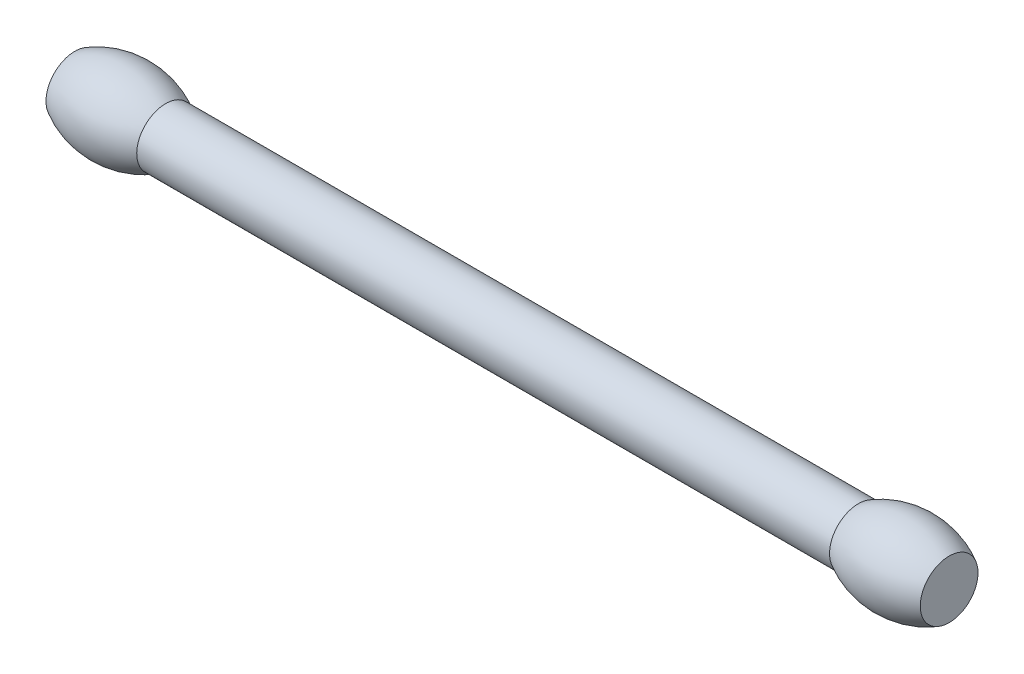
ISO-10303-21;
HEADER;
FILE_DESCRIPTION(('STEP AP214'),'2;1');
FILE_NAME('part.step','',(''),(''),'','','');
FILE_SCHEMA(('AUTOMOTIVE_DESIGN { 1 0 10303 214 1 1 1 1 }'));
ENDSEC;
DATA;
#1=APPLICATION_CONTEXT('core data for automotive mechanical design processes');
#2=APPLICATION_PROTOCOL_DEFINITION('international standard','automotive_design',2000,#1);
#3=PRODUCT_CONTEXT('',#1,'mechanical');
#4=PRODUCT('Part','Part','',(#3));
#5=PRODUCT_RELATED_PRODUCT_CATEGORY('part','',(#4));
#6=PRODUCT_DEFINITION_FORMATION('','',#4);
#7=PRODUCT_DEFINITION_CONTEXT('part definition',#1,'design');
#8=PRODUCT_DEFINITION('design','',#6,#7);
#9=PRODUCT_DEFINITION_SHAPE('','',#8);
#10=(LENGTH_UNIT() NAMED_UNIT(*) SI_UNIT(.MILLI.,.METRE.));
#11=(NAMED_UNIT(*) PLANE_ANGLE_UNIT() SI_UNIT($,.RADIAN.));
#12=(NAMED_UNIT(*) SI_UNIT($,.STERADIAN.) SOLID_ANGLE_UNIT());
#13=UNCERTAINTY_MEASURE_WITH_UNIT(LENGTH_MEASURE(1.E-05),#10,'distance_accuracy_value','');
#14=(GEOMETRIC_REPRESENTATION_CONTEXT(3) GLOBAL_UNCERTAINTY_ASSIGNED_CONTEXT((#13)) GLOBAL_UNIT_ASSIGNED_CONTEXT((#10,
#11,#12)) REPRESENTATION_CONTEXT('',''));
#15=CARTESIAN_POINT('',(0.,0.,0.));
#16=DIRECTION('',(0.,0.,1.));
#17=DIRECTION('',(1.,0.,0.));
#18=AXIS2_PLACEMENT_3D('',#15,#16,#17);
#19=CARTESIAN_POINT('',(54.2925,0.,0.));
#20=DIRECTION('',(-1.,0.,0.));
#21=DIRECTION('',(0.,-1.,0.));
#22=AXIS2_PLACEMENT_3D('',#19,#20,#21);
#23=DEGENERATE_TOROIDAL_SURFACE('',#22,7.14252884615383,12.7940288461538,.F.);
#24=CARTESIAN_POINT('',(60.579,0.,0.));
#25=DIRECTION('',(-1.,0.,0.));
#26=DIRECTION('',(0.,-1.,0.));
#27=AXIS2_PLACEMENT_3D('',#24,#25,#26);
#28=CIRCLE('',#27,4.00050000000001);
#29=CARTESIAN_POINT('',(60.579,-4.00050000000001,0.));
#30=VERTEX_POINT('',#29);
#31=EDGE_CURVE('E56',#30,#30,#28,.T.);
#32=ORIENTED_EDGE('',*,*,#31,.T.);
#33=EDGE_LOOP('',(#32));
#34=FACE_BOUND('',#33,.T.);
#35=CARTESIAN_POINT('',(48.006,0.,0.));
#36=DIRECTION('',(-1.,0.,0.));
#37=DIRECTION('',(0.,-1.,0.));
#38=AXIS2_PLACEMENT_3D('',#35,#36,#37);
#39=CIRCLE('',#38,4.00050000000001);
#40=CARTESIAN_POINT('',(48.006,-4.00050000000002,0.));
#41=VERTEX_POINT('',#40);
#42=EDGE_CURVE('E12',#41,#41,#39,.T.);
#43=ORIENTED_EDGE('',*,*,#42,.F.);
#44=EDGE_LOOP('',(#43));
#45=FACE_BOUND('',#44,.T.);
#46=ADVANCED_FACE('F42',(#34,#45),#23,.F.);
#47=CARTESIAN_POINT('',(66.4090284621284,0.,0.));
#48=DIRECTION('',(-1.,0.,0.));
#49=DIRECTION('',(0.,-1.,0.));
#50=AXIS2_PLACEMENT_3D('',#47,#48,#49);
#51=CYLINDRICAL_SURFACE('',#50,4.00050000000001);
#52=CARTESIAN_POINT('',(-48.006,0.,0.));
#53=DIRECTION('',(-1.,0.,0.));
#54=DIRECTION('',(0.,-1.,0.));
#55=AXIS2_PLACEMENT_3D('',#52,#53,#54);
#56=CIRCLE('',#55,4.00050000000001);
#57=CARTESIAN_POINT('',(-48.006,-4.00050000000005,0.));
#58=VERTEX_POINT('',#57);
#59=EDGE_CURVE('E48',#58,#58,#56,.T.);
#60=ORIENTED_EDGE('',*,*,#59,.F.);
#61=EDGE_LOOP('',(#60));
#62=FACE_BOUND('',#61,.T.);
#63=ORIENTED_EDGE('',*,*,#42,.T.);
#64=EDGE_LOOP('',(#63));
#65=FACE_BOUND('',#64,.T.);
#66=ADVANCED_FACE('F75',(#62,#65),#51,.T.);
#67=CARTESIAN_POINT('',(-54.2925,0.,0.));
#68=DIRECTION('',(-1.,0.,0.));
#69=DIRECTION('',(0.,-1.,0.));
#70=AXIS2_PLACEMENT_3D('',#67,#68,#69);
#71=DEGENERATE_TOROIDAL_SURFACE('',#70,7.14252884615382,12.7940288461538,.F.);
#72=CARTESIAN_POINT('',(-60.579,0.,0.));
#73=DIRECTION('',(-1.,0.,0.));
#74=DIRECTION('',(0.,-1.,0.));
#75=AXIS2_PLACEMENT_3D('',#72,#73,#74);
#76=CIRCLE('',#75,4.00050000000001);
#77=CARTESIAN_POINT('',(-60.579,-4.00050000000002,0.));
#78=VERTEX_POINT('',#77);
#79=EDGE_CURVE('E52',#78,#78,#76,.T.);
#80=ORIENTED_EDGE('',*,*,#79,.F.);
#81=EDGE_LOOP('',(#80));
#82=FACE_BOUND('',#81,.T.);
#83=ORIENTED_EDGE('',*,*,#59,.T.);
#84=EDGE_LOOP('',(#83));
#85=FACE_BOUND('',#84,.T.);
#86=ADVANCED_FACE('F71',(#82,#85),#71,.F.);
#87=CARTESIAN_POINT('',(-60.579,0.,0.));
#88=DIRECTION('',(-1.,0.,0.));
#89=DIRECTION('',(0.,-1.,0.));
#90=AXIS2_PLACEMENT_3D('',#87,#88,#89);
#91=PLANE('',#90);
#92=ORIENTED_EDGE('',*,*,#79,.T.);
#93=EDGE_LOOP('',(#92));
#94=FACE_BOUND('',#93,.T.);
#95=ADVANCED_FACE('F66',(#94),#91,.T.);
#96=CARTESIAN_POINT('',(60.579,0.,0.));
#97=DIRECTION('',(-1.,0.,0.));
#98=DIRECTION('',(0.,-1.,0.));
#99=AXIS2_PLACEMENT_3D('',#96,#97,#98);
#100=PLANE('',#99);
#101=ORIENTED_EDGE('',*,*,#31,.F.);
#102=EDGE_LOOP('',(#101));
#103=FACE_BOUND('',#102,.T.);
#104=ADVANCED_FACE('F64',(#103),#100,.F.);
#105=CLOSED_SHELL('',(#46,#66,#86,#95,#104));
#106=MANIFOLD_SOLID_BREP('B2',#105);
#107=ADVANCED_BREP_SHAPE_REPRESENTATION('',(#18,#106),#14);
#108=SHAPE_DEFINITION_REPRESENTATION(#9,#107);
ENDSEC;
END-ISO-10303-21;
